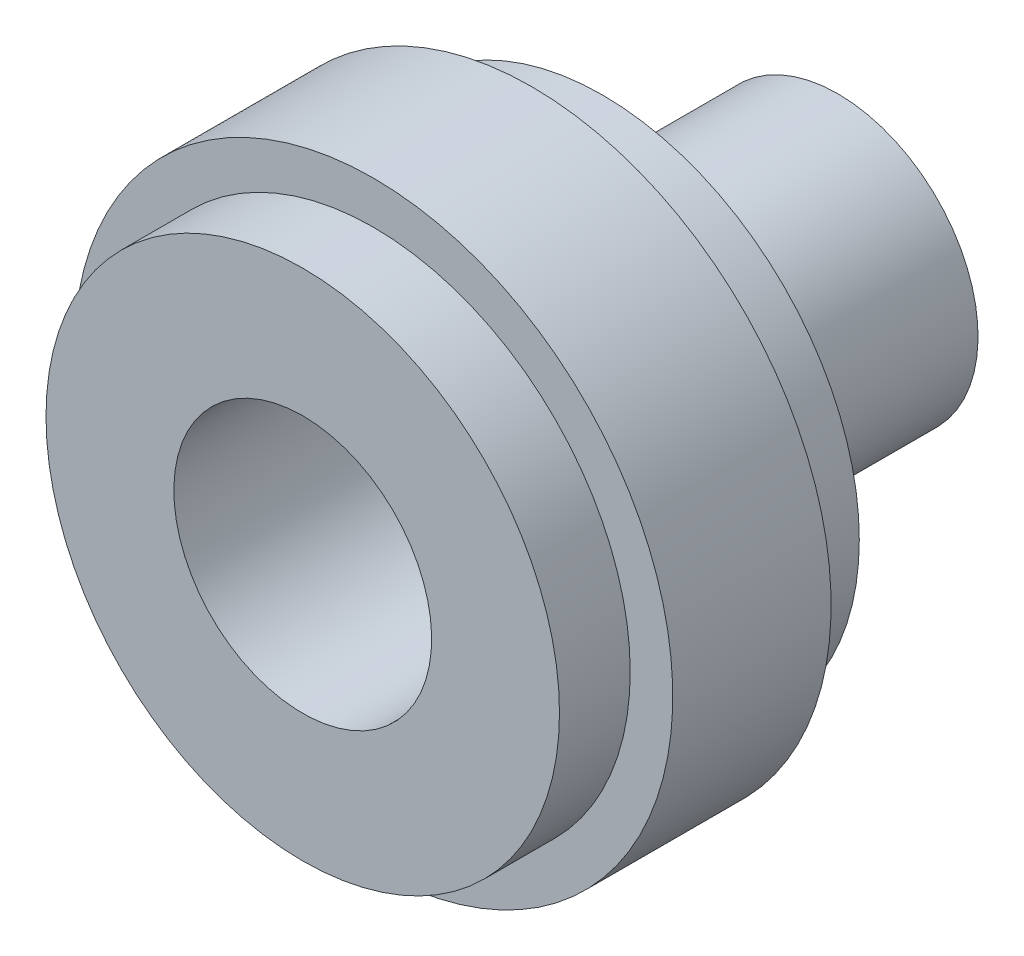
ISO-10303-21;
HEADER;
FILE_DESCRIPTION(('STEP AP214'),'2;1');
FILE_NAME('part.step','',(''),(''),'','','');
FILE_SCHEMA(('AUTOMOTIVE_DESIGN { 1 0 10303 214 1 1 1 1 }'));
ENDSEC;
DATA;
#1=APPLICATION_CONTEXT('core data for automotive mechanical design processes');
#2=APPLICATION_PROTOCOL_DEFINITION('international standard','automotive_design',2000,#1);
#3=PRODUCT_CONTEXT('',#1,'mechanical');
#4=PRODUCT('Part','Part','',(#3));
#5=PRODUCT_RELATED_PRODUCT_CATEGORY('part','',(#4));
#6=PRODUCT_DEFINITION_FORMATION('','',#4);
#7=PRODUCT_DEFINITION_CONTEXT('part definition',#1,'design');
#8=PRODUCT_DEFINITION('design','',#6,#7);
#9=PRODUCT_DEFINITION_SHAPE('','',#8);
#10=(LENGTH_UNIT() NAMED_UNIT(*) SI_UNIT(.MILLI.,.METRE.));
#11=(NAMED_UNIT(*) PLANE_ANGLE_UNIT() SI_UNIT($,.RADIAN.));
#12=(NAMED_UNIT(*) SI_UNIT($,.STERADIAN.) SOLID_ANGLE_UNIT());
#13=UNCERTAINTY_MEASURE_WITH_UNIT(LENGTH_MEASURE(1.E-05),#10,'distance_accuracy_value','');
#14=(GEOMETRIC_REPRESENTATION_CONTEXT(3) GLOBAL_UNCERTAINTY_ASSIGNED_CONTEXT((#13)) GLOBAL_UNIT_ASSIGNED_CONTEXT((#10,
#11,#12)) REPRESENTATION_CONTEXT('',''));
#15=CARTESIAN_POINT('',(0.,0.,0.));
#16=DIRECTION('',(0.,0.,1.));
#17=DIRECTION('',(1.,0.,0.));
#18=AXIS2_PLACEMENT_3D('',#15,#16,#17);
#19=CARTESIAN_POINT('',(0.,4.6736,-1.1938));
#20=DIRECTION('',(0.,0.,1.));
#21=DIRECTION('',(0.,-1.,0.));
#22=AXIS2_PLACEMENT_3D('',#19,#20,#21);
#23=PLANE('',#22);
#24=CARTESIAN_POINT('',(0.,0.,-1.1938));
#25=DIRECTION('',(0.,0.,-1.));
#26=DIRECTION('',(0.,1.,0.));
#27=AXIS2_PLACEMENT_3D('',#24,#25,#26);
#28=CIRCLE('',#27,1.7526);
#29=CARTESIAN_POINT('',(0.,1.7526,-1.1938));
#30=VERTEX_POINT('',#29);
#31=EDGE_CURVE('E10',#30,#30,#28,.T.);
#32=ORIENTED_EDGE('',*,*,#31,.T.);
#33=EDGE_LOOP('',(#32));
#34=FACE_BOUND('',#33,.T.);
#35=CARTESIAN_POINT('',(0.,0.,-1.1938));
#36=DIRECTION('',(0.,0.,-1.));
#37=DIRECTION('',(0.,1.,0.));
#38=AXIS2_PLACEMENT_3D('',#35,#36,#37);
#39=CIRCLE('',#38,4.6736);
#40=CARTESIAN_POINT('',(0.,4.6736,-1.1938));
#41=VERTEX_POINT('',#40);
#42=EDGE_CURVE('E71',#41,#41,#39,.T.);
#43=ORIENTED_EDGE('',*,*,#42,.F.);
#44=EDGE_LOOP('',(#43));
#45=FACE_BOUND('',#44,.T.);
#46=ADVANCED_FACE('F31',(#34,#45),#23,.T.);
#47=CARTESIAN_POINT('',(0.,0.,0.));
#48=DIRECTION('',(0.,0.,-1.));
#49=DIRECTION('',(0.,1.,0.));
#50=AXIS2_PLACEMENT_3D('',#47,#48,#49);
#51=CYLINDRICAL_SURFACE('',#50,1.7526);
#52=CARTESIAN_POINT('',(0.,0.,-13.97));
#53=DIRECTION('',(0.,0.,-1.));
#54=DIRECTION('',(0.,1.,0.));
#55=AXIS2_PLACEMENT_3D('',#52,#53,#54);
#56=CIRCLE('',#55,1.7526);
#57=CARTESIAN_POINT('',(0.,1.7526,-13.97));
#58=VERTEX_POINT('',#57);
#59=EDGE_CURVE('E37',#58,#58,#56,.T.);
#60=ORIENTED_EDGE('',*,*,#59,.T.);
#61=EDGE_LOOP('',(#60));
#62=FACE_BOUND('',#61,.T.);
#63=ORIENTED_EDGE('',*,*,#31,.F.);
#64=EDGE_LOOP('',(#63));
#65=FACE_BOUND('',#64,.T.);
#66=ADVANCED_FACE('F79',(#62,#65),#51,.F.);
#67=CARTESIAN_POINT('',(0.,1.7526,-13.97));
#68=DIRECTION('',(0.,0.,-1.));
#69=DIRECTION('',(0.,1.,0.));
#70=AXIS2_PLACEMENT_3D('',#67,#68,#69);
#71=PLANE('',#70);
#72=CARTESIAN_POINT('',(0.,0.,-13.97));
#73=DIRECTION('',(0.,0.,-1.));
#74=DIRECTION('',(0.,1.,0.));
#75=AXIS2_PLACEMENT_3D('',#72,#73,#74);
#76=CIRCLE('',#75,5.08);
#77=CARTESIAN_POINT('',(0.,5.08,-13.97));
#78=VERTEX_POINT('',#77);
#79=EDGE_CURVE('E41',#78,#78,#76,.T.);
#80=ORIENTED_EDGE('',*,*,#79,.T.);
#81=EDGE_LOOP('',(#80));
#82=FACE_BOUND('',#81,.T.);
#83=ORIENTED_EDGE('',*,*,#59,.F.);
#84=EDGE_LOOP('',(#83));
#85=FACE_BOUND('',#84,.T.);
#86=ADVANCED_FACE('F83',(#82,#85),#71,.T.);
#87=CARTESIAN_POINT('',(0.,0.,0.));
#88=DIRECTION('',(0.,0.,-1.));
#89=DIRECTION('',(0.,1.,0.));
#90=AXIS2_PLACEMENT_3D('',#87,#88,#89);
#91=CYLINDRICAL_SURFACE('',#90,5.08);
#92=CARTESIAN_POINT('',(0.,0.,-5.4356));
#93=DIRECTION('',(0.,0.,-1.));
#94=DIRECTION('',(0.,1.,0.));
#95=AXIS2_PLACEMENT_3D('',#92,#93,#94);
#96=CIRCLE('',#95,5.08);
#97=CARTESIAN_POINT('',(0.,5.08,-5.4356));
#98=VERTEX_POINT('',#97);
#99=EDGE_CURVE('E45',#98,#98,#96,.T.);
#100=ORIENTED_EDGE('',*,*,#99,.T.);
#101=EDGE_LOOP('',(#100));
#102=FACE_BOUND('',#101,.T.);
#103=ORIENTED_EDGE('',*,*,#79,.F.);
#104=EDGE_LOOP('',(#103));
#105=FACE_BOUND('',#104,.T.);
#106=ADVANCED_FACE('F87',(#102,#105),#91,.T.);
#107=CARTESIAN_POINT('',(0.,5.08,-5.4356));
#108=DIRECTION('',(0.,0.,-1.));
#109=DIRECTION('',(0.,1.,0.));
#110=AXIS2_PLACEMENT_3D('',#107,#108,#109);
#111=PLANE('',#110);
#112=CARTESIAN_POINT('',(0.,0.,-5.4356));
#113=DIRECTION('',(0.,0.,-1.));
#114=DIRECTION('',(0.,1.,0.));
#115=AXIS2_PLACEMENT_3D('',#112,#113,#114);
#116=CIRCLE('',#115,9.3091);
#117=CARTESIAN_POINT('',(0.,9.3091,-5.4356));
#118=VERTEX_POINT('',#117);
#119=EDGE_CURVE('E50',#118,#118,#116,.T.);
#120=ORIENTED_EDGE('',*,*,#119,.T.);
#121=EDGE_LOOP('',(#120));
#122=FACE_BOUND('',#121,.T.);
#123=ORIENTED_EDGE('',*,*,#99,.F.);
#124=EDGE_LOOP('',(#123));
#125=FACE_BOUND('',#124,.T.);
#126=ADVANCED_FACE('F94',(#122,#125),#111,.T.);
#127=CARTESIAN_POINT('',(0.,0.,0.));
#128=DIRECTION('',(0.,0.,-1.));
#129=DIRECTION('',(0.,1.,0.));
#130=AXIS2_PLACEMENT_3D('',#127,#128,#129);
#131=CYLINDRICAL_SURFACE('',#130,9.3091);
#132=CARTESIAN_POINT('',(0.,0.,-2.8702));
#133=DIRECTION('',(0.,0.,-1.));
#134=DIRECTION('',(0.,1.,0.));
#135=AXIS2_PLACEMENT_3D('',#132,#133,#134);
#136=CIRCLE('',#135,9.3091);
#137=CARTESIAN_POINT('',(0.,9.3091,-2.8702));
#138=VERTEX_POINT('',#137);
#139=EDGE_CURVE('E53',#138,#138,#136,.T.);
#140=ORIENTED_EDGE('',*,*,#139,.T.);
#141=EDGE_LOOP('',(#140));
#142=FACE_BOUND('',#141,.T.);
#143=ORIENTED_EDGE('',*,*,#119,.F.);
#144=EDGE_LOOP('',(#143));
#145=FACE_BOUND('',#144,.T.);
#146=ADVANCED_FACE('F98',(#142,#145),#131,.T.);
#147=CARTESIAN_POINT('',(0.,9.3091,-2.8702));
#148=DIRECTION('',(0.,0.,-1.));
#149=DIRECTION('',(0.,1.,0.));
#150=AXIS2_PLACEMENT_3D('',#147,#148,#149);
#151=PLANE('',#150);
#152=CARTESIAN_POINT('',(0.,0.,-2.8702));
#153=DIRECTION('',(0.,0.,-1.));
#154=DIRECTION('',(0.,1.,0.));
#155=AXIS2_PLACEMENT_3D('',#152,#153,#154);
#156=CIRCLE('',#155,10.85215);
#157=CARTESIAN_POINT('',(0.,10.85215,-2.8702));
#158=VERTEX_POINT('',#157);
#159=EDGE_CURVE('E56',#158,#158,#156,.T.);
#160=ORIENTED_EDGE('',*,*,#159,.T.);
#161=EDGE_LOOP('',(#160));
#162=FACE_BOUND('',#161,.T.);
#163=ORIENTED_EDGE('',*,*,#139,.F.);
#164=EDGE_LOOP('',(#163));
#165=FACE_BOUND('',#164,.T.);
#166=ADVANCED_FACE('F102',(#162,#165),#151,.T.);
#167=CARTESIAN_POINT('',(0.,0.,0.));
#168=DIRECTION('',(0.,0.,-1.));
#169=DIRECTION('',(0.,1.,0.));
#170=AXIS2_PLACEMENT_3D('',#167,#168,#169);
#171=CYLINDRICAL_SURFACE('',#170,10.85215);
#172=CARTESIAN_POINT('',(0.,0.,2.8702));
#173=DIRECTION('',(0.,0.,-1.));
#174=DIRECTION('',(0.,1.,0.));
#175=AXIS2_PLACEMENT_3D('',#172,#173,#174);
#176=CIRCLE('',#175,10.85215);
#177=CARTESIAN_POINT('',(0.,10.85215,2.8702));
#178=VERTEX_POINT('',#177);
#179=EDGE_CURVE('E59',#178,#178,#176,.T.);
#180=ORIENTED_EDGE('',*,*,#179,.T.);
#181=EDGE_LOOP('',(#180));
#182=FACE_BOUND('',#181,.T.);
#183=ORIENTED_EDGE('',*,*,#159,.F.);
#184=EDGE_LOOP('',(#183));
#185=FACE_BOUND('',#184,.T.);
#186=ADVANCED_FACE('F106',(#182,#185),#171,.T.);
#187=CARTESIAN_POINT('',(0.,10.85215,2.8702));
#188=DIRECTION('',(0.,0.,1.));
#189=DIRECTION('',(0.,-1.,0.));
#190=AXIS2_PLACEMENT_3D('',#187,#188,#189);
#191=PLANE('',#190);
#192=CARTESIAN_POINT('',(0.,0.,2.8702));
#193=DIRECTION('',(0.,0.,-1.));
#194=DIRECTION('',(0.,1.,0.));
#195=AXIS2_PLACEMENT_3D('',#192,#193,#194);
#196=CIRCLE('',#195,9.3091);
#197=CARTESIAN_POINT('',(0.,9.3091,2.8702));
#198=VERTEX_POINT('',#197);
#199=EDGE_CURVE('E62',#198,#198,#196,.T.);
#200=ORIENTED_EDGE('',*,*,#199,.T.);
#201=EDGE_LOOP('',(#200));
#202=FACE_BOUND('',#201,.T.);
#203=ORIENTED_EDGE('',*,*,#179,.F.);
#204=EDGE_LOOP('',(#203));
#205=FACE_BOUND('',#204,.T.);
#206=ADVANCED_FACE('F110',(#202,#205),#191,.T.);
#207=CARTESIAN_POINT('',(0.,0.,0.));
#208=DIRECTION('',(0.,0.,-1.));
#209=DIRECTION('',(0.,1.,0.));
#210=AXIS2_PLACEMENT_3D('',#207,#208,#209);
#211=CYLINDRICAL_SURFACE('',#210,9.3091);
#212=CARTESIAN_POINT('',(0.,0.,5.4356));
#213=DIRECTION('',(0.,0.,-1.));
#214=DIRECTION('',(0.,1.,0.));
#215=AXIS2_PLACEMENT_3D('',#212,#213,#214);
#216=CIRCLE('',#215,9.3091);
#217=CARTESIAN_POINT('',(0.,9.3091,5.4356));
#218=VERTEX_POINT('',#217);
#219=EDGE_CURVE('E65',#218,#218,#216,.T.);
#220=ORIENTED_EDGE('',*,*,#219,.T.);
#221=EDGE_LOOP('',(#220));
#222=FACE_BOUND('',#221,.T.);
#223=ORIENTED_EDGE('',*,*,#199,.F.);
#224=EDGE_LOOP('',(#223));
#225=FACE_BOUND('',#224,.T.);
#226=ADVANCED_FACE('F114',(#222,#225),#211,.T.);
#227=CARTESIAN_POINT('',(0.,9.3091,5.4356));
#228=DIRECTION('',(0.,0.,1.));
#229=DIRECTION('',(0.,-1.,0.));
#230=AXIS2_PLACEMENT_3D('',#227,#228,#229);
#231=PLANE('',#230);
#232=CARTESIAN_POINT('',(0.,0.,5.4356));
#233=DIRECTION('',(0.,0.,-1.));
#234=DIRECTION('',(0.,1.,0.));
#235=AXIS2_PLACEMENT_3D('',#232,#233,#234);
#236=CIRCLE('',#235,4.6736);
#237=CARTESIAN_POINT('',(0.,4.6736,5.4356));
#238=VERTEX_POINT('',#237);
#239=EDGE_CURVE('E68',#238,#238,#236,.T.);
#240=ORIENTED_EDGE('',*,*,#239,.T.);
#241=EDGE_LOOP('',(#240));
#242=FACE_BOUND('',#241,.T.);
#243=ORIENTED_EDGE('',*,*,#219,.F.);
#244=EDGE_LOOP('',(#243));
#245=FACE_BOUND('',#244,.T.);
#246=ADVANCED_FACE('F118',(#242,#245),#231,.T.);
#247=CARTESIAN_POINT('',(0.,0.,0.));
#248=DIRECTION('',(0.,0.,-1.));
#249=DIRECTION('',(0.,1.,0.));
#250=AXIS2_PLACEMENT_3D('',#247,#248,#249);
#251=CYLINDRICAL_SURFACE('',#250,4.6736);
#252=ORIENTED_EDGE('',*,*,#42,.T.);
#253=EDGE_LOOP('',(#252));
#254=FACE_BOUND('',#253,.T.);
#255=ORIENTED_EDGE('',*,*,#239,.F.);
#256=EDGE_LOOP('',(#255));
#257=FACE_BOUND('',#256,.T.);
#258=ADVANCED_FACE('F75',(#254,#257),#251,.F.);
#259=CLOSED_SHELL('',(#46,#66,#86,#106,#126,#146,#166,#186,#206,#226,#246,#258));
#260=MANIFOLD_SOLID_BREP('B2',#259);
#261=ADVANCED_BREP_SHAPE_REPRESENTATION('',(#18,#260),#14);
#262=SHAPE_DEFINITION_REPRESENTATION(#9,#261);
ENDSEC;
END-ISO-10303-21;
